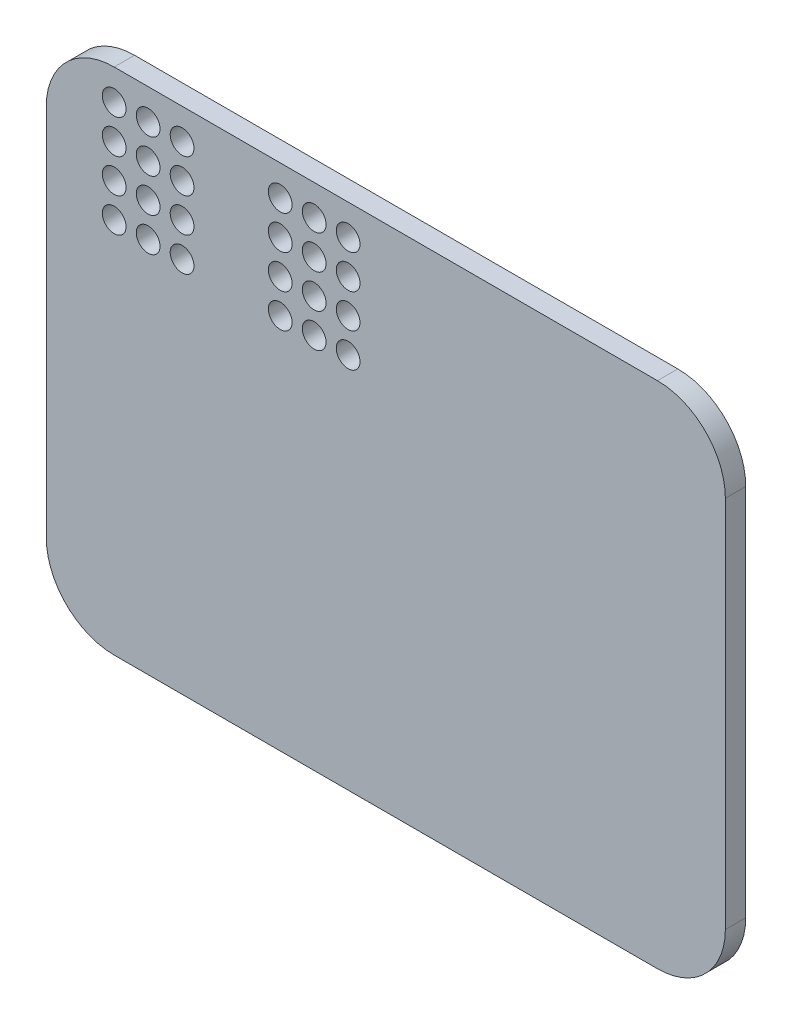
ISO-10303-21;
HEADER;
FILE_DESCRIPTION(('STEP AP214'),'2;1');
FILE_NAME('part.step','',(''),(''),'','','');
FILE_SCHEMA(('AUTOMOTIVE_DESIGN { 1 0 10303 214 1 1 1 1 }'));
ENDSEC;
DATA;
#1=APPLICATION_CONTEXT('core data for automotive mechanical design processes');
#2=APPLICATION_PROTOCOL_DEFINITION('international standard','automotive_design',2000,#1);
#3=PRODUCT_CONTEXT('',#1,'mechanical');
#4=PRODUCT('Part','Part','',(#3));
#5=PRODUCT_RELATED_PRODUCT_CATEGORY('part','',(#4));
#6=PRODUCT_DEFINITION_FORMATION('','',#4);
#7=PRODUCT_DEFINITION_CONTEXT('part definition',#1,'design');
#8=PRODUCT_DEFINITION('design','',#6,#7);
#9=PRODUCT_DEFINITION_SHAPE('','',#8);
#10=(LENGTH_UNIT() NAMED_UNIT(*) SI_UNIT(.MILLI.,.METRE.));
#11=(NAMED_UNIT(*) PLANE_ANGLE_UNIT() SI_UNIT($,.RADIAN.));
#12=(NAMED_UNIT(*) SI_UNIT($,.STERADIAN.) SOLID_ANGLE_UNIT());
#13=UNCERTAINTY_MEASURE_WITH_UNIT(LENGTH_MEASURE(1.E-05),#10,'distance_accuracy_value','');
#14=(GEOMETRIC_REPRESENTATION_CONTEXT(3) GLOBAL_UNCERTAINTY_ASSIGNED_CONTEXT((#13)) GLOBAL_UNIT_ASSIGNED_CONTEXT((#10,
#11,#12)) REPRESENTATION_CONTEXT('',''));
#15=CARTESIAN_POINT('',(0.,0.,0.));
#16=DIRECTION('',(0.,0.,1.));
#17=DIRECTION('',(1.,0.,0.));
#18=AXIS2_PLACEMENT_3D('',#15,#16,#17);
#19=CARTESIAN_POINT('',(10.,65.,3.));
#20=DIRECTION('',(0.,0.,-1.));
#21=DIRECTION('',(-1.,0.,0.));
#22=AXIS2_PLACEMENT_3D('',#19,#20,#21);
#23=PLANE('',#22);
#24=CARTESIAN_POINT('',(10.,65.,3.));
#25=DIRECTION('',(0.,0.,1.));
#26=DIRECTION('',(-1.,0.,0.));
#27=AXIS2_PLACEMENT_3D('',#24,#25,#26);
#28=CIRCLE('',#27,10.);
#29=CARTESIAN_POINT('',(10.0000000000001,75.,3.));
#30=VERTEX_POINT('',#29);
#31=CARTESIAN_POINT('',(0.,64.9999999999999,3.));
#32=VERTEX_POINT('',#31);
#33=EDGE_CURVE('E170',#30,#32,#28,.T.);
#34=ORIENTED_EDGE('',*,*,#33,.T.);
#35=DIRECTION('',(0.,-1.,0.));
#36=VECTOR('',#35,1.);
#37=CARTESIAN_POINT('',(0.,10.0000000000001,3.));
#38=LINE('',#37,#36);
#39=CARTESIAN_POINT('',(0.,10.0000000000001,3.));
#40=VERTEX_POINT('',#39);
#41=EDGE_CURVE('E106',#32,#40,#38,.T.);
#42=ORIENTED_EDGE('',*,*,#41,.T.);
#43=CARTESIAN_POINT('',(10.,10.,3.));
#44=DIRECTION('',(0.,0.,1.));
#45=DIRECTION('',(-1.,0.,0.));
#46=AXIS2_PLACEMENT_3D('',#43,#44,#45);
#47=CIRCLE('',#46,10.);
#48=CARTESIAN_POINT('',(10.0000000000001,0.,3.));
#49=VERTEX_POINT('',#48);
#50=EDGE_CURVE('E191',#40,#49,#47,.T.);
#51=ORIENTED_EDGE('',*,*,#50,.T.);
#52=DIRECTION('',(1.,0.,0.));
#53=VECTOR('',#52,1.);
#54=CARTESIAN_POINT('',(10.0000000000001,0.,3.));
#55=LINE('',#54,#53);
#56=CARTESIAN_POINT('',(89.9999999999999,0.,3.));
#57=VERTEX_POINT('',#56);
#58=EDGE_CURVE('E205',#49,#57,#55,.T.);
#59=ORIENTED_EDGE('',*,*,#58,.T.);
#60=CARTESIAN_POINT('',(90.,10.,3.));
#61=DIRECTION('',(0.,0.,1.));
#62=DIRECTION('',(1.,0.,0.));
#63=AXIS2_PLACEMENT_3D('',#60,#61,#62);
#64=CIRCLE('',#63,10.);
#65=CARTESIAN_POINT('',(100.,10.,3.));
#66=VERTEX_POINT('',#65);
#67=EDGE_CURVE('E125',#57,#66,#64,.T.);
#68=ORIENTED_EDGE('',*,*,#67,.T.);
#69=DIRECTION('',(0.,1.,0.));
#70=VECTOR('',#69,1.);
#71=CARTESIAN_POINT('',(100.,10.0000000000001,3.));
#72=LINE('',#71,#70);
#73=CARTESIAN_POINT('',(100.,64.9999999999999,3.));
#74=VERTEX_POINT('',#73);
#75=EDGE_CURVE('E119',#66,#74,#72,.T.);
#76=ORIENTED_EDGE('',*,*,#75,.T.);
#77=CARTESIAN_POINT('',(90.,65.,3.));
#78=DIRECTION('',(0.,0.,1.));
#79=DIRECTION('',(-1.,0.,0.));
#80=AXIS2_PLACEMENT_3D('',#77,#78,#79);
#81=CIRCLE('',#80,9.99999999999999);
#82=CARTESIAN_POINT('',(89.9999999999999,75.,3.));
#83=VERTEX_POINT('',#82);
#84=EDGE_CURVE('E123',#74,#83,#81,.T.);
#85=ORIENTED_EDGE('',*,*,#84,.T.);
#86=DIRECTION('',(-1.,0.,0.));
#87=VECTOR('',#86,1.);
#88=CARTESIAN_POINT('',(10.0000000000001,75.,3.));
#89=LINE('',#88,#87);
#90=EDGE_CURVE('E63',#83,#30,#89,.T.);
#91=ORIENTED_EDGE('',*,*,#90,.T.);
#92=EDGE_LOOP('',(#34,#42,#51,#59,#68,#76,#85,#91));
#93=FACE_BOUND('',#92,.T.);
#94=CARTESIAN_POINT('',(10.,70.5,3.));
#95=DIRECTION('',(0.,0.,1.));
#96=DIRECTION('',(1.,0.,0.));
#97=AXIS2_PLACEMENT_3D('',#94,#95,#96);
#98=CIRCLE('',#97,1.75);
#99=CARTESIAN_POINT('',(11.75,70.5,3.));
#100=VERTEX_POINT('',#99);
#101=EDGE_CURVE('E152',#100,#100,#98,.T.);
#102=ORIENTED_EDGE('',*,*,#101,.F.);
#103=EDGE_LOOP('',(#102));
#104=FACE_BOUND('',#103,.T.);
#105=CARTESIAN_POINT('',(10.0000000000001,65.5,3.));
#106=DIRECTION('',(0.,0.,1.));
#107=DIRECTION('',(1.,0.,0.));
#108=AXIS2_PLACEMENT_3D('',#105,#106,#107);
#109=CIRCLE('',#108,1.75);
#110=CARTESIAN_POINT('',(11.7500000000001,65.5,3.));
#111=VERTEX_POINT('',#110);
#112=EDGE_CURVE('E219',#111,#111,#109,.T.);
#113=ORIENTED_EDGE('',*,*,#112,.F.);
#114=EDGE_LOOP('',(#113));
#115=FACE_BOUND('',#114,.T.);
#116=CARTESIAN_POINT('',(10.0000000000001,60.5,3.));
#117=DIRECTION('',(0.,0.,1.));
#118=DIRECTION('',(1.,0.,0.));
#119=AXIS2_PLACEMENT_3D('',#116,#117,#118);
#120=CIRCLE('',#119,1.75);
#121=CARTESIAN_POINT('',(11.7500000000001,60.5,3.));
#122=VERTEX_POINT('',#121);
#123=EDGE_CURVE('E227',#122,#122,#120,.T.);
#124=ORIENTED_EDGE('',*,*,#123,.F.);
#125=EDGE_LOOP('',(#124));
#126=FACE_BOUND('',#125,.T.);
#127=CARTESIAN_POINT('',(10.0000000000002,55.5,3.));
#128=DIRECTION('',(0.,0.,1.));
#129=DIRECTION('',(1.,0.,0.));
#130=AXIS2_PLACEMENT_3D('',#127,#128,#129);
#131=CIRCLE('',#130,1.75);
#132=CARTESIAN_POINT('',(11.7500000000002,55.5,3.));
#133=VERTEX_POINT('',#132);
#134=EDGE_CURVE('E235',#133,#133,#131,.T.);
#135=ORIENTED_EDGE('',*,*,#134,.F.);
#136=EDGE_LOOP('',(#135));
#137=FACE_BOUND('',#136,.T.);
#138=CARTESIAN_POINT('',(15.,70.5,3.));
#139=DIRECTION('',(0.,0.,1.));
#140=DIRECTION('',(1.,0.,0.));
#141=AXIS2_PLACEMENT_3D('',#138,#139,#140);
#142=CIRCLE('',#141,1.75);
#143=CARTESIAN_POINT('',(16.75,70.5,3.));
#144=VERTEX_POINT('',#143);
#145=EDGE_CURVE('E243',#144,#144,#142,.T.);
#146=ORIENTED_EDGE('',*,*,#145,.F.);
#147=EDGE_LOOP('',(#146));
#148=FACE_BOUND('',#147,.T.);
#149=CARTESIAN_POINT('',(15.0000000000001,65.5,3.));
#150=DIRECTION('',(0.,0.,1.));
#151=DIRECTION('',(1.,0.,0.));
#152=AXIS2_PLACEMENT_3D('',#149,#150,#151);
#153=CIRCLE('',#152,1.75);
#154=CARTESIAN_POINT('',(16.7500000000001,65.5,3.));
#155=VERTEX_POINT('',#154);
#156=EDGE_CURVE('E251',#155,#155,#153,.T.);
#157=ORIENTED_EDGE('',*,*,#156,.F.);
#158=EDGE_LOOP('',(#157));
#159=FACE_BOUND('',#158,.T.);
#160=CARTESIAN_POINT('',(15.0000000000001,60.5,3.));
#161=DIRECTION('',(0.,0.,1.));
#162=DIRECTION('',(1.,0.,0.));
#163=AXIS2_PLACEMENT_3D('',#160,#161,#162);
#164=CIRCLE('',#163,1.75);
#165=CARTESIAN_POINT('',(16.7500000000001,60.5,3.));
#166=VERTEX_POINT('',#165);
#167=EDGE_CURVE('E259',#166,#166,#164,.T.);
#168=ORIENTED_EDGE('',*,*,#167,.F.);
#169=EDGE_LOOP('',(#168));
#170=FACE_BOUND('',#169,.T.);
#171=CARTESIAN_POINT('',(15.0000000000002,55.5,3.));
#172=DIRECTION('',(0.,0.,1.));
#173=DIRECTION('',(1.,0.,0.));
#174=AXIS2_PLACEMENT_3D('',#171,#172,#173);
#175=CIRCLE('',#174,1.75);
#176=CARTESIAN_POINT('',(16.7500000000002,55.5,3.));
#177=VERTEX_POINT('',#176);
#178=EDGE_CURVE('E267',#177,#177,#175,.T.);
#179=ORIENTED_EDGE('',*,*,#178,.F.);
#180=EDGE_LOOP('',(#179));
#181=FACE_BOUND('',#180,.T.);
#182=CARTESIAN_POINT('',(20.,70.5,3.));
#183=DIRECTION('',(0.,0.,1.));
#184=DIRECTION('',(1.,0.,0.));
#185=AXIS2_PLACEMENT_3D('',#182,#183,#184);
#186=CIRCLE('',#185,1.75);
#187=CARTESIAN_POINT('',(21.75,70.5,3.));
#188=VERTEX_POINT('',#187);
#189=EDGE_CURVE('E275',#188,#188,#186,.T.);
#190=ORIENTED_EDGE('',*,*,#189,.F.);
#191=EDGE_LOOP('',(#190));
#192=FACE_BOUND('',#191,.T.);
#193=CARTESIAN_POINT('',(20.0000000000001,65.5,3.));
#194=DIRECTION('',(0.,0.,1.));
#195=DIRECTION('',(1.,0.,0.));
#196=AXIS2_PLACEMENT_3D('',#193,#194,#195);
#197=CIRCLE('',#196,1.75);
#198=CARTESIAN_POINT('',(21.7500000000001,65.5,3.));
#199=VERTEX_POINT('',#198);
#200=EDGE_CURVE('E283',#199,#199,#197,.T.);
#201=ORIENTED_EDGE('',*,*,#200,.F.);
#202=EDGE_LOOP('',(#201));
#203=FACE_BOUND('',#202,.T.);
#204=CARTESIAN_POINT('',(20.0000000000001,60.5,3.));
#205=DIRECTION('',(0.,0.,1.));
#206=DIRECTION('',(1.,0.,0.));
#207=AXIS2_PLACEMENT_3D('',#204,#205,#206);
#208=CIRCLE('',#207,1.75);
#209=CARTESIAN_POINT('',(21.7500000000001,60.5,3.));
#210=VERTEX_POINT('',#209);
#211=EDGE_CURVE('E291',#210,#210,#208,.T.);
#212=ORIENTED_EDGE('',*,*,#211,.F.);
#213=EDGE_LOOP('',(#212));
#214=FACE_BOUND('',#213,.T.);
#215=CARTESIAN_POINT('',(20.0000000000002,55.5,3.));
#216=DIRECTION('',(0.,0.,1.));
#217=DIRECTION('',(1.,0.,0.));
#218=AXIS2_PLACEMENT_3D('',#215,#216,#217);
#219=CIRCLE('',#218,1.75);
#220=CARTESIAN_POINT('',(21.7500000000002,55.5,3.));
#221=VERTEX_POINT('',#220);
#222=EDGE_CURVE('E299',#221,#221,#219,.T.);
#223=ORIENTED_EDGE('',*,*,#222,.F.);
#224=EDGE_LOOP('',(#223));
#225=FACE_BOUND('',#224,.T.);
#226=CARTESIAN_POINT('',(34.45,70.5,3.));
#227=DIRECTION('',(0.,0.,1.));
#228=DIRECTION('',(1.,0.,0.));
#229=AXIS2_PLACEMENT_3D('',#226,#227,#228);
#230=CIRCLE('',#229,1.75);
#231=CARTESIAN_POINT('',(36.2,70.5,3.));
#232=VERTEX_POINT('',#231);
#233=EDGE_CURVE('E307',#232,#232,#230,.T.);
#234=ORIENTED_EDGE('',*,*,#233,.F.);
#235=EDGE_LOOP('',(#234));
#236=FACE_BOUND('',#235,.T.);
#237=CARTESIAN_POINT('',(34.4500000000001,65.5,3.));
#238=DIRECTION('',(0.,0.,1.));
#239=DIRECTION('',(1.,0.,0.));
#240=AXIS2_PLACEMENT_3D('',#237,#238,#239);
#241=CIRCLE('',#240,1.75);
#242=CARTESIAN_POINT('',(36.2000000000001,65.5,3.));
#243=VERTEX_POINT('',#242);
#244=EDGE_CURVE('E315',#243,#243,#241,.T.);
#245=ORIENTED_EDGE('',*,*,#244,.F.);
#246=EDGE_LOOP('',(#245));
#247=FACE_BOUND('',#246,.T.);
#248=CARTESIAN_POINT('',(34.4500000000001,60.5,3.));
#249=DIRECTION('',(0.,0.,1.));
#250=DIRECTION('',(1.,0.,0.));
#251=AXIS2_PLACEMENT_3D('',#248,#249,#250);
#252=CIRCLE('',#251,1.75);
#253=CARTESIAN_POINT('',(36.2000000000001,60.5,3.));
#254=VERTEX_POINT('',#253);
#255=EDGE_CURVE('E323',#254,#254,#252,.T.);
#256=ORIENTED_EDGE('',*,*,#255,.F.);
#257=EDGE_LOOP('',(#256));
#258=FACE_BOUND('',#257,.T.);
#259=CARTESIAN_POINT('',(34.4500000000002,55.5,3.));
#260=DIRECTION('',(0.,0.,1.));
#261=DIRECTION('',(1.,0.,0.));
#262=AXIS2_PLACEMENT_3D('',#259,#260,#261);
#263=CIRCLE('',#262,1.75);
#264=CARTESIAN_POINT('',(36.2000000000002,55.5,3.));
#265=VERTEX_POINT('',#264);
#266=EDGE_CURVE('E331',#265,#265,#263,.T.);
#267=ORIENTED_EDGE('',*,*,#266,.F.);
#268=EDGE_LOOP('',(#267));
#269=FACE_BOUND('',#268,.T.);
#270=CARTESIAN_POINT('',(39.45,70.5,3.));
#271=DIRECTION('',(0.,0.,1.));
#272=DIRECTION('',(1.,0.,0.));
#273=AXIS2_PLACEMENT_3D('',#270,#271,#272);
#274=CIRCLE('',#273,1.75);
#275=CARTESIAN_POINT('',(41.2,70.5,3.));
#276=VERTEX_POINT('',#275);
#277=EDGE_CURVE('E339',#276,#276,#274,.T.);
#278=ORIENTED_EDGE('',*,*,#277,.F.);
#279=EDGE_LOOP('',(#278));
#280=FACE_BOUND('',#279,.T.);
#281=CARTESIAN_POINT('',(39.45,65.5,3.));
#282=DIRECTION('',(0.,0.,1.));
#283=DIRECTION('',(1.,0.,0.));
#284=AXIS2_PLACEMENT_3D('',#281,#282,#283);
#285=CIRCLE('',#284,1.75);
#286=CARTESIAN_POINT('',(41.2,65.5,3.));
#287=VERTEX_POINT('',#286);
#288=EDGE_CURVE('E347',#287,#287,#285,.T.);
#289=ORIENTED_EDGE('',*,*,#288,.F.);
#290=EDGE_LOOP('',(#289));
#291=FACE_BOUND('',#290,.T.);
#292=CARTESIAN_POINT('',(39.4500000000001,60.5,3.));
#293=DIRECTION('',(0.,0.,1.));
#294=DIRECTION('',(1.,0.,0.));
#295=AXIS2_PLACEMENT_3D('',#292,#293,#294);
#296=CIRCLE('',#295,1.75);
#297=CARTESIAN_POINT('',(41.2000000000001,60.5,3.));
#298=VERTEX_POINT('',#297);
#299=EDGE_CURVE('E355',#298,#298,#296,.T.);
#300=ORIENTED_EDGE('',*,*,#299,.F.);
#301=EDGE_LOOP('',(#300));
#302=FACE_BOUND('',#301,.T.);
#303=CARTESIAN_POINT('',(39.4500000000002,55.5,3.));
#304=DIRECTION('',(0.,0.,1.));
#305=DIRECTION('',(1.,0.,0.));
#306=AXIS2_PLACEMENT_3D('',#303,#304,#305);
#307=CIRCLE('',#306,1.75);
#308=CARTESIAN_POINT('',(41.2000000000002,55.5,3.));
#309=VERTEX_POINT('',#308);
#310=EDGE_CURVE('E363',#309,#309,#307,.T.);
#311=ORIENTED_EDGE('',*,*,#310,.F.);
#312=EDGE_LOOP('',(#311));
#313=FACE_BOUND('',#312,.T.);
#314=CARTESIAN_POINT('',(44.45,70.5,3.));
#315=DIRECTION('',(0.,0.,1.));
#316=DIRECTION('',(1.,0.,0.));
#317=AXIS2_PLACEMENT_3D('',#314,#315,#316);
#318=CIRCLE('',#317,1.75);
#319=CARTESIAN_POINT('',(46.2,70.5,3.));
#320=VERTEX_POINT('',#319);
#321=EDGE_CURVE('E371',#320,#320,#318,.T.);
#322=ORIENTED_EDGE('',*,*,#321,.F.);
#323=EDGE_LOOP('',(#322));
#324=FACE_BOUND('',#323,.T.);
#325=CARTESIAN_POINT('',(44.45,65.5,3.));
#326=DIRECTION('',(0.,0.,1.));
#327=DIRECTION('',(1.,0.,0.));
#328=AXIS2_PLACEMENT_3D('',#325,#326,#327);
#329=CIRCLE('',#328,1.75);
#330=CARTESIAN_POINT('',(46.2,65.5,3.));
#331=VERTEX_POINT('',#330);
#332=EDGE_CURVE('E379',#331,#331,#329,.T.);
#333=ORIENTED_EDGE('',*,*,#332,.F.);
#334=EDGE_LOOP('',(#333));
#335=FACE_BOUND('',#334,.T.);
#336=CARTESIAN_POINT('',(44.4500000000001,60.5,3.));
#337=DIRECTION('',(0.,0.,1.));
#338=DIRECTION('',(1.,0.,0.));
#339=AXIS2_PLACEMENT_3D('',#336,#337,#338);
#340=CIRCLE('',#339,1.75);
#341=CARTESIAN_POINT('',(46.2000000000001,60.5,3.));
#342=VERTEX_POINT('',#341);
#343=EDGE_CURVE('E387',#342,#342,#340,.T.);
#344=ORIENTED_EDGE('',*,*,#343,.F.);
#345=EDGE_LOOP('',(#344));
#346=FACE_BOUND('',#345,.T.);
#347=CARTESIAN_POINT('',(44.4500000000002,55.5,3.));
#348=DIRECTION('',(0.,0.,1.));
#349=DIRECTION('',(1.,0.,0.));
#350=AXIS2_PLACEMENT_3D('',#347,#348,#349);
#351=CIRCLE('',#350,1.75);
#352=CARTESIAN_POINT('',(46.2000000000002,55.5,3.));
#353=VERTEX_POINT('',#352);
#354=EDGE_CURVE('E395',#353,#353,#351,.T.);
#355=ORIENTED_EDGE('',*,*,#354,.F.);
#356=EDGE_LOOP('',(#355));
#357=FACE_BOUND('',#356,.T.);
#358=ADVANCED_FACE('F45',(#93,#104,#115,#126,#137,#148,#159,#170,#181,#192,#203,#214,#225,#236,
#247,#258,#269,#280,#291,#302,#313,#324,#335,#346,#357),#23,.F.);
#359=CARTESIAN_POINT('',(10.,65.,0.));
#360=DIRECTION('',(0.,0.,-1.));
#361=DIRECTION('',(-1.,0.,0.));
#362=AXIS2_PLACEMENT_3D('',#359,#360,#361);
#363=PLANE('',#362);
#364=CARTESIAN_POINT('',(44.4500000000001,60.5,0.));
#365=DIRECTION('',(0.,0.,1.));
#366=DIRECTION('',(1.,0.,0.));
#367=AXIS2_PLACEMENT_3D('',#364,#365,#366);
#368=CIRCLE('',#367,1.75);
#369=CARTESIAN_POINT('',(46.2000000000001,60.5,0.));
#370=VERTEX_POINT('',#369);
#371=EDGE_CURVE('E391',#370,#370,#368,.T.);
#372=ORIENTED_EDGE('',*,*,#371,.T.);
#373=EDGE_LOOP('',(#372));
#374=FACE_BOUND('',#373,.T.);
#375=CARTESIAN_POINT('',(44.45,70.5,0.));
#376=DIRECTION('',(0.,0.,1.));
#377=DIRECTION('',(1.,0.,0.));
#378=AXIS2_PLACEMENT_3D('',#375,#376,#377);
#379=CIRCLE('',#378,1.75);
#380=CARTESIAN_POINT('',(46.2,70.5,0.));
#381=VERTEX_POINT('',#380);
#382=EDGE_CURVE('E375',#381,#381,#379,.T.);
#383=ORIENTED_EDGE('',*,*,#382,.T.);
#384=EDGE_LOOP('',(#383));
#385=FACE_BOUND('',#384,.T.);
#386=CARTESIAN_POINT('',(39.4500000000001,60.5,0.));
#387=DIRECTION('',(0.,0.,1.));
#388=DIRECTION('',(1.,0.,0.));
#389=AXIS2_PLACEMENT_3D('',#386,#387,#388);
#390=CIRCLE('',#389,1.75);
#391=CARTESIAN_POINT('',(41.2000000000001,60.5,0.));
#392=VERTEX_POINT('',#391);
#393=EDGE_CURVE('E359',#392,#392,#390,.T.);
#394=ORIENTED_EDGE('',*,*,#393,.T.);
#395=EDGE_LOOP('',(#394));
#396=FACE_BOUND('',#395,.T.);
#397=CARTESIAN_POINT('',(39.45,70.5,0.));
#398=DIRECTION('',(0.,0.,1.));
#399=DIRECTION('',(1.,0.,0.));
#400=AXIS2_PLACEMENT_3D('',#397,#398,#399);
#401=CIRCLE('',#400,1.75);
#402=CARTESIAN_POINT('',(41.2,70.5,0.));
#403=VERTEX_POINT('',#402);
#404=EDGE_CURVE('E343',#403,#403,#401,.T.);
#405=ORIENTED_EDGE('',*,*,#404,.T.);
#406=EDGE_LOOP('',(#405));
#407=FACE_BOUND('',#406,.T.);
#408=CARTESIAN_POINT('',(34.4500000000001,60.5,0.));
#409=DIRECTION('',(0.,0.,1.));
#410=DIRECTION('',(1.,0.,0.));
#411=AXIS2_PLACEMENT_3D('',#408,#409,#410);
#412=CIRCLE('',#411,1.75);
#413=CARTESIAN_POINT('',(36.2000000000001,60.5,0.));
#414=VERTEX_POINT('',#413);
#415=EDGE_CURVE('E327',#414,#414,#412,.T.);
#416=ORIENTED_EDGE('',*,*,#415,.T.);
#417=EDGE_LOOP('',(#416));
#418=FACE_BOUND('',#417,.T.);
#419=CARTESIAN_POINT('',(34.45,70.5,0.));
#420=DIRECTION('',(0.,0.,1.));
#421=DIRECTION('',(1.,0.,0.));
#422=AXIS2_PLACEMENT_3D('',#419,#420,#421);
#423=CIRCLE('',#422,1.75);
#424=CARTESIAN_POINT('',(36.2,70.5,0.));
#425=VERTEX_POINT('',#424);
#426=EDGE_CURVE('E311',#425,#425,#423,.T.);
#427=ORIENTED_EDGE('',*,*,#426,.T.);
#428=EDGE_LOOP('',(#427));
#429=FACE_BOUND('',#428,.T.);
#430=CARTESIAN_POINT('',(20.0000000000001,60.5,0.));
#431=DIRECTION('',(0.,0.,1.));
#432=DIRECTION('',(1.,0.,0.));
#433=AXIS2_PLACEMENT_3D('',#430,#431,#432);
#434=CIRCLE('',#433,1.75);
#435=CARTESIAN_POINT('',(21.7500000000001,60.5,0.));
#436=VERTEX_POINT('',#435);
#437=EDGE_CURVE('E295',#436,#436,#434,.T.);
#438=ORIENTED_EDGE('',*,*,#437,.T.);
#439=EDGE_LOOP('',(#438));
#440=FACE_BOUND('',#439,.T.);
#441=CARTESIAN_POINT('',(20.,70.5,0.));
#442=DIRECTION('',(0.,0.,1.));
#443=DIRECTION('',(1.,0.,0.));
#444=AXIS2_PLACEMENT_3D('',#441,#442,#443);
#445=CIRCLE('',#444,1.75);
#446=CARTESIAN_POINT('',(21.75,70.5,0.));
#447=VERTEX_POINT('',#446);
#448=EDGE_CURVE('E279',#447,#447,#445,.T.);
#449=ORIENTED_EDGE('',*,*,#448,.T.);
#450=EDGE_LOOP('',(#449));
#451=FACE_BOUND('',#450,.T.);
#452=CARTESIAN_POINT('',(15.0000000000001,60.5,0.));
#453=DIRECTION('',(0.,0.,1.));
#454=DIRECTION('',(1.,0.,0.));
#455=AXIS2_PLACEMENT_3D('',#452,#453,#454);
#456=CIRCLE('',#455,1.75);
#457=CARTESIAN_POINT('',(16.7500000000001,60.5,0.));
#458=VERTEX_POINT('',#457);
#459=EDGE_CURVE('E263',#458,#458,#456,.T.);
#460=ORIENTED_EDGE('',*,*,#459,.T.);
#461=EDGE_LOOP('',(#460));
#462=FACE_BOUND('',#461,.T.);
#463=CARTESIAN_POINT('',(15.,70.5,0.));
#464=DIRECTION('',(0.,0.,1.));
#465=DIRECTION('',(1.,0.,0.));
#466=AXIS2_PLACEMENT_3D('',#463,#464,#465);
#467=CIRCLE('',#466,1.75);
#468=CARTESIAN_POINT('',(16.75,70.5,0.));
#469=VERTEX_POINT('',#468);
#470=EDGE_CURVE('E247',#469,#469,#467,.T.);
#471=ORIENTED_EDGE('',*,*,#470,.T.);
#472=EDGE_LOOP('',(#471));
#473=FACE_BOUND('',#472,.T.);
#474=CARTESIAN_POINT('',(10.0000000000001,60.5,0.));
#475=DIRECTION('',(0.,0.,1.));
#476=DIRECTION('',(1.,0.,0.));
#477=AXIS2_PLACEMENT_3D('',#474,#475,#476);
#478=CIRCLE('',#477,1.75);
#479=CARTESIAN_POINT('',(11.7500000000001,60.5,0.));
#480=VERTEX_POINT('',#479);
#481=EDGE_CURVE('E231',#480,#480,#478,.T.);
#482=ORIENTED_EDGE('',*,*,#481,.T.);
#483=EDGE_LOOP('',(#482));
#484=FACE_BOUND('',#483,.T.);
#485=CARTESIAN_POINT('',(10.,70.5,0.));
#486=DIRECTION('',(0.,0.,1.));
#487=DIRECTION('',(1.,0.,0.));
#488=AXIS2_PLACEMENT_3D('',#485,#486,#487);
#489=CIRCLE('',#488,1.75);
#490=CARTESIAN_POINT('',(11.75,70.5,0.));
#491=VERTEX_POINT('',#490);
#492=EDGE_CURVE('E215',#491,#491,#489,.T.);
#493=ORIENTED_EDGE('',*,*,#492,.T.);
#494=EDGE_LOOP('',(#493));
#495=FACE_BOUND('',#494,.T.);
#496=CARTESIAN_POINT('',(10.,65.,0.));
#497=DIRECTION('',(0.,0.,1.));
#498=DIRECTION('',(-1.,0.,0.));
#499=AXIS2_PLACEMENT_3D('',#496,#497,#498);
#500=CIRCLE('',#499,10.);
#501=CARTESIAN_POINT('',(10.0000000000001,75.,0.));
#502=VERTEX_POINT('',#501);
#503=CARTESIAN_POINT('',(0.,64.9999999999999,0.));
#504=VERTEX_POINT('',#503);
#505=EDGE_CURVE('E147',#502,#504,#500,.T.);
#506=ORIENTED_EDGE('',*,*,#505,.F.);
#507=DIRECTION('',(-1.,0.,0.));
#508=VECTOR('',#507,1.);
#509=CARTESIAN_POINT('',(10.0000000000001,75.,0.));
#510=LINE('',#509,#508);
#511=CARTESIAN_POINT('',(89.9999999999999,75.,0.));
#512=VERTEX_POINT('',#511);
#513=EDGE_CURVE('E98',#512,#502,#510,.T.);
#514=ORIENTED_EDGE('',*,*,#513,.F.);
#515=CARTESIAN_POINT('',(90.,65.,0.));
#516=DIRECTION('',(0.,0.,1.));
#517=DIRECTION('',(-1.,0.,0.));
#518=AXIS2_PLACEMENT_3D('',#515,#516,#517);
#519=CIRCLE('',#518,9.99999999999999);
#520=CARTESIAN_POINT('',(100.,64.9999999999999,0.));
#521=VERTEX_POINT('',#520);
#522=EDGE_CURVE('E92',#521,#512,#519,.T.);
#523=ORIENTED_EDGE('',*,*,#522,.F.);
#524=DIRECTION('',(0.,1.,0.));
#525=VECTOR('',#524,1.);
#526=CARTESIAN_POINT('',(100.,10.0000000000001,0.));
#527=LINE('',#526,#525);
#528=CARTESIAN_POINT('',(100.,10.,0.));
#529=VERTEX_POINT('',#528);
#530=EDGE_CURVE('E134',#529,#521,#527,.T.);
#531=ORIENTED_EDGE('',*,*,#530,.F.);
#532=CARTESIAN_POINT('',(90.,10.,0.));
#533=DIRECTION('',(0.,0.,1.));
#534=DIRECTION('',(1.,0.,0.));
#535=AXIS2_PLACEMENT_3D('',#532,#533,#534);
#536=CIRCLE('',#535,10.);
#537=CARTESIAN_POINT('',(89.9999999999999,0.,0.));
#538=VERTEX_POINT('',#537);
#539=EDGE_CURVE('E161',#538,#529,#536,.T.);
#540=ORIENTED_EDGE('',*,*,#539,.F.);
#541=DIRECTION('',(1.,0.,0.));
#542=VECTOR('',#541,1.);
#543=CARTESIAN_POINT('',(10.0000000000001,0.,0.));
#544=LINE('',#543,#542);
#545=CARTESIAN_POINT('',(10.0000000000001,0.,0.));
#546=VERTEX_POINT('',#545);
#547=EDGE_CURVE('E158',#546,#538,#544,.T.);
#548=ORIENTED_EDGE('',*,*,#547,.F.);
#549=CARTESIAN_POINT('',(10.,10.,0.));
#550=DIRECTION('',(0.,0.,1.));
#551=DIRECTION('',(-1.,0.,0.));
#552=AXIS2_PLACEMENT_3D('',#549,#550,#551);
#553=CIRCLE('',#552,10.);
#554=CARTESIAN_POINT('',(0.,10.0000000000001,0.));
#555=VERTEX_POINT('',#554);
#556=EDGE_CURVE('E155',#555,#546,#553,.T.);
#557=ORIENTED_EDGE('',*,*,#556,.F.);
#558=DIRECTION('',(0.,-1.,0.));
#559=VECTOR('',#558,1.);
#560=CARTESIAN_POINT('',(0.,10.0000000000001,0.));
#561=LINE('',#560,#559);
#562=EDGE_CURVE('E151',#504,#555,#561,.T.);
#563=ORIENTED_EDGE('',*,*,#562,.F.);
#564=EDGE_LOOP('',(#506,#514,#523,#531,#540,#548,#557,#563));
#565=FACE_BOUND('',#564,.T.);
#566=CARTESIAN_POINT('',(10.0000000000001,65.5,0.));
#567=DIRECTION('',(0.,0.,1.));
#568=DIRECTION('',(1.,0.,0.));
#569=AXIS2_PLACEMENT_3D('',#566,#567,#568);
#570=CIRCLE('',#569,1.75);
#571=CARTESIAN_POINT('',(11.7500000000001,65.5,0.));
#572=VERTEX_POINT('',#571);
#573=EDGE_CURVE('E223',#572,#572,#570,.T.);
#574=ORIENTED_EDGE('',*,*,#573,.T.);
#575=EDGE_LOOP('',(#574));
#576=FACE_BOUND('',#575,.T.);
#577=CARTESIAN_POINT('',(10.0000000000002,55.5,0.));
#578=DIRECTION('',(0.,0.,1.));
#579=DIRECTION('',(1.,0.,0.));
#580=AXIS2_PLACEMENT_3D('',#577,#578,#579);
#581=CIRCLE('',#580,1.75);
#582=CARTESIAN_POINT('',(11.7500000000002,55.5,0.));
#583=VERTEX_POINT('',#582);
#584=EDGE_CURVE('E239',#583,#583,#581,.T.);
#585=ORIENTED_EDGE('',*,*,#584,.T.);
#586=EDGE_LOOP('',(#585));
#587=FACE_BOUND('',#586,.T.);
#588=CARTESIAN_POINT('',(15.0000000000001,65.5,0.));
#589=DIRECTION('',(0.,0.,1.));
#590=DIRECTION('',(1.,0.,0.));
#591=AXIS2_PLACEMENT_3D('',#588,#589,#590);
#592=CIRCLE('',#591,1.75);
#593=CARTESIAN_POINT('',(16.7500000000001,65.5,0.));
#594=VERTEX_POINT('',#593);
#595=EDGE_CURVE('E255',#594,#594,#592,.T.);
#596=ORIENTED_EDGE('',*,*,#595,.T.);
#597=EDGE_LOOP('',(#596));
#598=FACE_BOUND('',#597,.T.);
#599=CARTESIAN_POINT('',(15.0000000000002,55.5,0.));
#600=DIRECTION('',(0.,0.,1.));
#601=DIRECTION('',(1.,0.,0.));
#602=AXIS2_PLACEMENT_3D('',#599,#600,#601);
#603=CIRCLE('',#602,1.75);
#604=CARTESIAN_POINT('',(16.7500000000002,55.5,0.));
#605=VERTEX_POINT('',#604);
#606=EDGE_CURVE('E271',#605,#605,#603,.T.);
#607=ORIENTED_EDGE('',*,*,#606,.T.);
#608=EDGE_LOOP('',(#607));
#609=FACE_BOUND('',#608,.T.);
#610=CARTESIAN_POINT('',(20.0000000000001,65.5,0.));
#611=DIRECTION('',(0.,0.,1.));
#612=DIRECTION('',(1.,0.,0.));
#613=AXIS2_PLACEMENT_3D('',#610,#611,#612);
#614=CIRCLE('',#613,1.75);
#615=CARTESIAN_POINT('',(21.7500000000001,65.5,0.));
#616=VERTEX_POINT('',#615);
#617=EDGE_CURVE('E287',#616,#616,#614,.T.);
#618=ORIENTED_EDGE('',*,*,#617,.T.);
#619=EDGE_LOOP('',(#618));
#620=FACE_BOUND('',#619,.T.);
#621=CARTESIAN_POINT('',(20.0000000000002,55.5,0.));
#622=DIRECTION('',(0.,0.,1.));
#623=DIRECTION('',(1.,0.,0.));
#624=AXIS2_PLACEMENT_3D('',#621,#622,#623);
#625=CIRCLE('',#624,1.75);
#626=CARTESIAN_POINT('',(21.7500000000002,55.5,0.));
#627=VERTEX_POINT('',#626);
#628=EDGE_CURVE('E303',#627,#627,#625,.T.);
#629=ORIENTED_EDGE('',*,*,#628,.T.);
#630=EDGE_LOOP('',(#629));
#631=FACE_BOUND('',#630,.T.);
#632=CARTESIAN_POINT('',(34.4500000000001,65.5,0.));
#633=DIRECTION('',(0.,0.,1.));
#634=DIRECTION('',(1.,0.,0.));
#635=AXIS2_PLACEMENT_3D('',#632,#633,#634);
#636=CIRCLE('',#635,1.75);
#637=CARTESIAN_POINT('',(36.2000000000001,65.5,0.));
#638=VERTEX_POINT('',#637);
#639=EDGE_CURVE('E319',#638,#638,#636,.T.);
#640=ORIENTED_EDGE('',*,*,#639,.T.);
#641=EDGE_LOOP('',(#640));
#642=FACE_BOUND('',#641,.T.);
#643=CARTESIAN_POINT('',(34.4500000000002,55.5,0.));
#644=DIRECTION('',(0.,0.,1.));
#645=DIRECTION('',(1.,0.,0.));
#646=AXIS2_PLACEMENT_3D('',#643,#644,#645);
#647=CIRCLE('',#646,1.75);
#648=CARTESIAN_POINT('',(36.2000000000002,55.5,0.));
#649=VERTEX_POINT('',#648);
#650=EDGE_CURVE('E335',#649,#649,#647,.T.);
#651=ORIENTED_EDGE('',*,*,#650,.T.);
#652=EDGE_LOOP('',(#651));
#653=FACE_BOUND('',#652,.T.);
#654=CARTESIAN_POINT('',(39.45,65.5,0.));
#655=DIRECTION('',(0.,0.,1.));
#656=DIRECTION('',(1.,0.,0.));
#657=AXIS2_PLACEMENT_3D('',#654,#655,#656);
#658=CIRCLE('',#657,1.75);
#659=CARTESIAN_POINT('',(41.2,65.5,0.));
#660=VERTEX_POINT('',#659);
#661=EDGE_CURVE('E351',#660,#660,#658,.T.);
#662=ORIENTED_EDGE('',*,*,#661,.T.);
#663=EDGE_LOOP('',(#662));
#664=FACE_BOUND('',#663,.T.);
#665=CARTESIAN_POINT('',(39.4500000000002,55.5,0.));
#666=DIRECTION('',(0.,0.,1.));
#667=DIRECTION('',(1.,0.,0.));
#668=AXIS2_PLACEMENT_3D('',#665,#666,#667);
#669=CIRCLE('',#668,1.75);
#670=CARTESIAN_POINT('',(41.2000000000002,55.5,0.));
#671=VERTEX_POINT('',#670);
#672=EDGE_CURVE('E367',#671,#671,#669,.T.);
#673=ORIENTED_EDGE('',*,*,#672,.T.);
#674=EDGE_LOOP('',(#673));
#675=FACE_BOUND('',#674,.T.);
#676=CARTESIAN_POINT('',(44.45,65.5,0.));
#677=DIRECTION('',(0.,0.,1.));
#678=DIRECTION('',(1.,0.,0.));
#679=AXIS2_PLACEMENT_3D('',#676,#677,#678);
#680=CIRCLE('',#679,1.75);
#681=CARTESIAN_POINT('',(46.2,65.5,0.));
#682=VERTEX_POINT('',#681);
#683=EDGE_CURVE('E383',#682,#682,#680,.T.);
#684=ORIENTED_EDGE('',*,*,#683,.T.);
#685=EDGE_LOOP('',(#684));
#686=FACE_BOUND('',#685,.T.);
#687=CARTESIAN_POINT('',(44.4500000000002,55.5,0.));
#688=DIRECTION('',(0.,0.,1.));
#689=DIRECTION('',(1.,0.,0.));
#690=AXIS2_PLACEMENT_3D('',#687,#688,#689);
#691=CIRCLE('',#690,1.75);
#692=CARTESIAN_POINT('',(46.2000000000002,55.5,0.));
#693=VERTEX_POINT('',#692);
#694=EDGE_CURVE('E399',#693,#693,#691,.T.);
#695=ORIENTED_EDGE('',*,*,#694,.T.);
#696=EDGE_LOOP('',(#695));
#697=FACE_BOUND('',#696,.T.);
#698=ADVANCED_FACE('F195',(#374,#385,#396,#407,#418,#429,#440,#451,#462,#473,#484,#495,#565,
#576,#587,#598,#609,#620,#631,#642,#653,#664,#675,#686,#697),#363,.T.);
#699=CARTESIAN_POINT('',(10.,65.,3.));
#700=DIRECTION('',(0.,0.,-1.));
#701=DIRECTION('',(-1.,0.,0.));
#702=AXIS2_PLACEMENT_3D('',#699,#700,#701);
#703=CYLINDRICAL_SURFACE('',#702,10.);
#704=ORIENTED_EDGE('',*,*,#505,.T.);
#705=DIRECTION('',(0.,0.,-1.));
#706=VECTOR('',#705,1.);
#707=CARTESIAN_POINT('',(0.,64.9999999999999,3.));
#708=LINE('',#707,#706);
#709=EDGE_CURVE('E11',#32,#504,#708,.T.);
#710=ORIENTED_EDGE('',*,*,#709,.F.);
#711=ORIENTED_EDGE('',*,*,#33,.F.);
#712=DIRECTION('',(0.,0.,-1.));
#713=VECTOR('',#712,1.);
#714=CARTESIAN_POINT('',(10.0000000000001,75.,3.));
#715=LINE('',#714,#713);
#716=EDGE_CURVE('E143',#30,#502,#715,.T.);
#717=ORIENTED_EDGE('',*,*,#716,.T.);
#718=EDGE_LOOP('',(#704,#710,#711,#717));
#719=FACE_BOUND('',#718,.T.);
#720=ADVANCED_FACE('F47',(#719),#703,.T.);
#721=CARTESIAN_POINT('',(0.,10.0000000000001,3.));
#722=DIRECTION('',(1.,0.,0.));
#723=DIRECTION('',(0.,0.,-1.));
#724=AXIS2_PLACEMENT_3D('',#721,#722,#723);
#725=PLANE('',#724);
#726=ORIENTED_EDGE('',*,*,#562,.T.);
#727=DIRECTION('',(0.,0.,-1.));
#728=VECTOR('',#727,1.);
#729=CARTESIAN_POINT('',(0.,10.0000000000001,3.));
#730=LINE('',#729,#728);
#731=EDGE_CURVE('E55',#40,#555,#730,.T.);
#732=ORIENTED_EDGE('',*,*,#731,.F.);
#733=ORIENTED_EDGE('',*,*,#41,.F.);
#734=ORIENTED_EDGE('',*,*,#709,.T.);
#735=EDGE_LOOP('',(#726,#732,#733,#734));
#736=FACE_BOUND('',#735,.T.);
#737=ADVANCED_FACE('F433',(#736),#725,.F.);
#738=CARTESIAN_POINT('',(10.,10.,3.));
#739=DIRECTION('',(0.,0.,-1.));
#740=DIRECTION('',(-1.,0.,0.));
#741=AXIS2_PLACEMENT_3D('',#738,#739,#740);
#742=CYLINDRICAL_SURFACE('',#741,10.);
#743=ORIENTED_EDGE('',*,*,#556,.T.);
#744=DIRECTION('',(0.,0.,-1.));
#745=VECTOR('',#744,1.);
#746=CARTESIAN_POINT('',(10.0000000000001,0.,3.));
#747=LINE('',#746,#745);
#748=EDGE_CURVE('E181',#49,#546,#747,.T.);
#749=ORIENTED_EDGE('',*,*,#748,.F.);
#750=ORIENTED_EDGE('',*,*,#50,.F.);
#751=ORIENTED_EDGE('',*,*,#731,.T.);
#752=EDGE_LOOP('',(#743,#749,#750,#751));
#753=FACE_BOUND('',#752,.T.);
#754=ADVANCED_FACE('F189',(#753),#742,.T.);
#755=CARTESIAN_POINT('',(10.0000000000001,0.,3.));
#756=DIRECTION('',(0.,1.,0.));
#757=DIRECTION('',(0.,0.,1.));
#758=AXIS2_PLACEMENT_3D('',#755,#756,#757);
#759=PLANE('',#758);
#760=ORIENTED_EDGE('',*,*,#547,.T.);
#761=DIRECTION('',(0.,0.,-1.));
#762=VECTOR('',#761,1.);
#763=CARTESIAN_POINT('',(89.9999999999999,0.,3.));
#764=LINE('',#763,#762);
#765=EDGE_CURVE('E177',#57,#538,#764,.T.);
#766=ORIENTED_EDGE('',*,*,#765,.F.);
#767=ORIENTED_EDGE('',*,*,#58,.F.);
#768=ORIENTED_EDGE('',*,*,#748,.T.);
#769=EDGE_LOOP('',(#760,#766,#767,#768));
#770=FACE_BOUND('',#769,.T.);
#771=ADVANCED_FACE('F200',(#770),#759,.F.);
#772=CARTESIAN_POINT('',(90.,10.,3.));
#773=DIRECTION('',(0.,0.,-1.));
#774=DIRECTION('',(-1.,0.,0.));
#775=AXIS2_PLACEMENT_3D('',#772,#773,#774);
#776=CYLINDRICAL_SURFACE('',#775,10.);
#777=ORIENTED_EDGE('',*,*,#539,.T.);
#778=DIRECTION('',(0.,0.,-1.));
#779=VECTOR('',#778,1.);
#780=CARTESIAN_POINT('',(100.,10.,3.));
#781=LINE('',#780,#779);
#782=EDGE_CURVE('E136',#66,#529,#781,.T.);
#783=ORIENTED_EDGE('',*,*,#782,.F.);
#784=ORIENTED_EDGE('',*,*,#67,.F.);
#785=ORIENTED_EDGE('',*,*,#765,.T.);
#786=EDGE_LOOP('',(#777,#783,#784,#785));
#787=FACE_BOUND('',#786,.T.);
#788=ADVANCED_FACE('F203',(#787),#776,.T.);
#789=CARTESIAN_POINT('',(100.,10.0000000000001,3.));
#790=DIRECTION('',(-1.,0.,0.));
#791=DIRECTION('',(0.,0.,1.));
#792=AXIS2_PLACEMENT_3D('',#789,#790,#791);
#793=PLANE('',#792);
#794=ORIENTED_EDGE('',*,*,#530,.T.);
#795=DIRECTION('',(0.,0.,-1.));
#796=VECTOR('',#795,1.);
#797=CARTESIAN_POINT('',(100.,64.9999999999999,3.));
#798=LINE('',#797,#796);
#799=EDGE_CURVE('E131',#74,#521,#798,.T.);
#800=ORIENTED_EDGE('',*,*,#799,.F.);
#801=ORIENTED_EDGE('',*,*,#75,.F.);
#802=ORIENTED_EDGE('',*,*,#782,.T.);
#803=EDGE_LOOP('',(#794,#800,#801,#802));
#804=FACE_BOUND('',#803,.T.);
#805=ADVANCED_FACE('F132',(#804),#793,.F.);
#806=CARTESIAN_POINT('',(90.,65.,3.));
#807=DIRECTION('',(0.,0.,-1.));
#808=DIRECTION('',(-1.,0.,0.));
#809=AXIS2_PLACEMENT_3D('',#806,#807,#808);
#810=CYLINDRICAL_SURFACE('',#809,9.99999999999999);
#811=ORIENTED_EDGE('',*,*,#522,.T.);
#812=DIRECTION('',(0.,0.,-1.));
#813=VECTOR('',#812,1.);
#814=CARTESIAN_POINT('',(89.9999999999999,75.,3.));
#815=LINE('',#814,#813);
#816=EDGE_CURVE('E137',#83,#512,#815,.T.);
#817=ORIENTED_EDGE('',*,*,#816,.F.);
#818=ORIENTED_EDGE('',*,*,#84,.F.);
#819=ORIENTED_EDGE('',*,*,#799,.T.);
#820=EDGE_LOOP('',(#811,#817,#818,#819));
#821=FACE_BOUND('',#820,.T.);
#822=ADVANCED_FACE('F139',(#821),#810,.T.);
#823=CARTESIAN_POINT('',(10.0000000000001,75.,3.));
#824=DIRECTION('',(0.,-1.,0.));
#825=DIRECTION('',(0.,0.,-1.));
#826=AXIS2_PLACEMENT_3D('',#823,#824,#825);
#827=PLANE('',#826);
#828=ORIENTED_EDGE('',*,*,#513,.T.);
#829=ORIENTED_EDGE('',*,*,#716,.F.);
#830=ORIENTED_EDGE('',*,*,#90,.F.);
#831=ORIENTED_EDGE('',*,*,#816,.T.);
#832=EDGE_LOOP('',(#828,#829,#830,#831));
#833=FACE_BOUND('',#832,.T.);
#834=ADVANCED_FACE('F421',(#833),#827,.F.);
#835=CARTESIAN_POINT('',(10.,70.5,3.));
#836=DIRECTION('',(0.,0.,-1.));
#837=DIRECTION('',(-1.,0.,0.));
#838=AXIS2_PLACEMENT_3D('',#835,#836,#837);
#839=CYLINDRICAL_SURFACE('',#838,1.75);
#840=ORIENTED_EDGE('',*,*,#101,.T.);
#841=EDGE_LOOP('',(#840));
#842=FACE_BOUND('',#841,.T.);
#843=ORIENTED_EDGE('',*,*,#492,.F.);
#844=EDGE_LOOP('',(#843));
#845=FACE_BOUND('',#844,.T.);
#846=ADVANCED_FACE('F418',(#842,#845),#839,.F.);
#847=CARTESIAN_POINT('',(10.0000000000001,65.5,3.));
#848=DIRECTION('',(0.,0.,-1.));
#849=DIRECTION('',(-1.,0.,0.));
#850=AXIS2_PLACEMENT_3D('',#847,#848,#849);
#851=CYLINDRICAL_SURFACE('',#850,1.75);
#852=ORIENTED_EDGE('',*,*,#112,.T.);
#853=EDGE_LOOP('',(#852));
#854=FACE_BOUND('',#853,.T.);
#855=ORIENTED_EDGE('',*,*,#573,.F.);
#856=EDGE_LOOP('',(#855));
#857=FACE_BOUND('',#856,.T.);
#858=ADVANCED_FACE('F496',(#854,#857),#851,.F.);
#859=CARTESIAN_POINT('',(10.0000000000001,60.5,3.));
#860=DIRECTION('',(0.,0.,-1.));
#861=DIRECTION('',(-1.,0.,0.));
#862=AXIS2_PLACEMENT_3D('',#859,#860,#861);
#863=CYLINDRICAL_SURFACE('',#862,1.75);
#864=ORIENTED_EDGE('',*,*,#123,.T.);
#865=EDGE_LOOP('',(#864));
#866=FACE_BOUND('',#865,.T.);
#867=ORIENTED_EDGE('',*,*,#481,.F.);
#868=EDGE_LOOP('',(#867));
#869=FACE_BOUND('',#868,.T.);
#870=ADVANCED_FACE('F504',(#866,#869),#863,.F.);
#871=CARTESIAN_POINT('',(10.0000000000002,55.5,3.));
#872=DIRECTION('',(0.,0.,-1.));
#873=DIRECTION('',(-1.,0.,0.));
#874=AXIS2_PLACEMENT_3D('',#871,#872,#873);
#875=CYLINDRICAL_SURFACE('',#874,1.75);
#876=ORIENTED_EDGE('',*,*,#134,.T.);
#877=EDGE_LOOP('',(#876));
#878=FACE_BOUND('',#877,.T.);
#879=ORIENTED_EDGE('',*,*,#584,.F.);
#880=EDGE_LOOP('',(#879));
#881=FACE_BOUND('',#880,.T.);
#882=ADVANCED_FACE('F512',(#878,#881),#875,.F.);
#883=CARTESIAN_POINT('',(15.,70.5,3.));
#884=DIRECTION('',(0.,0.,-1.));
#885=DIRECTION('',(-1.,0.,0.));
#886=AXIS2_PLACEMENT_3D('',#883,#884,#885);
#887=CYLINDRICAL_SURFACE('',#886,1.75);
#888=ORIENTED_EDGE('',*,*,#145,.T.);
#889=EDGE_LOOP('',(#888));
#890=FACE_BOUND('',#889,.T.);
#891=ORIENTED_EDGE('',*,*,#470,.F.);
#892=EDGE_LOOP('',(#891));
#893=FACE_BOUND('',#892,.T.);
#894=ADVANCED_FACE('F521',(#890,#893),#887,.F.);
#895=CARTESIAN_POINT('',(15.0000000000001,65.5,3.));
#896=DIRECTION('',(0.,0.,-1.));
#897=DIRECTION('',(-1.,0.,0.));
#898=AXIS2_PLACEMENT_3D('',#895,#896,#897);
#899=CYLINDRICAL_SURFACE('',#898,1.75);
#900=ORIENTED_EDGE('',*,*,#156,.T.);
#901=EDGE_LOOP('',(#900));
#902=FACE_BOUND('',#901,.T.);
#903=ORIENTED_EDGE('',*,*,#595,.F.);
#904=EDGE_LOOP('',(#903));
#905=FACE_BOUND('',#904,.T.);
#906=ADVANCED_FACE('F530',(#902,#905),#899,.F.);
#907=CARTESIAN_POINT('',(15.0000000000001,60.5,3.));
#908=DIRECTION('',(0.,0.,-1.));
#909=DIRECTION('',(-1.,0.,0.));
#910=AXIS2_PLACEMENT_3D('',#907,#908,#909);
#911=CYLINDRICAL_SURFACE('',#910,1.75);
#912=ORIENTED_EDGE('',*,*,#167,.T.);
#913=EDGE_LOOP('',(#912));
#914=FACE_BOUND('',#913,.T.);
#915=ORIENTED_EDGE('',*,*,#459,.F.);
#916=EDGE_LOOP('',(#915));
#917=FACE_BOUND('',#916,.T.);
#918=ADVANCED_FACE('F539',(#914,#917),#911,.F.);
#919=CARTESIAN_POINT('',(15.0000000000002,55.5,3.));
#920=DIRECTION('',(0.,0.,-1.));
#921=DIRECTION('',(-1.,0.,0.));
#922=AXIS2_PLACEMENT_3D('',#919,#920,#921);
#923=CYLINDRICAL_SURFACE('',#922,1.75);
#924=ORIENTED_EDGE('',*,*,#178,.T.);
#925=EDGE_LOOP('',(#924));
#926=FACE_BOUND('',#925,.T.);
#927=ORIENTED_EDGE('',*,*,#606,.F.);
#928=EDGE_LOOP('',(#927));
#929=FACE_BOUND('',#928,.T.);
#930=ADVANCED_FACE('F548',(#926,#929),#923,.F.);
#931=CARTESIAN_POINT('',(20.,70.5,3.));
#932=DIRECTION('',(0.,0.,-1.));
#933=DIRECTION('',(-1.,0.,0.));
#934=AXIS2_PLACEMENT_3D('',#931,#932,#933);
#935=CYLINDRICAL_SURFACE('',#934,1.75);
#936=ORIENTED_EDGE('',*,*,#189,.T.);
#937=EDGE_LOOP('',(#936));
#938=FACE_BOUND('',#937,.T.);
#939=ORIENTED_EDGE('',*,*,#448,.F.);
#940=EDGE_LOOP('',(#939));
#941=FACE_BOUND('',#940,.T.);
#942=ADVANCED_FACE('F557',(#938,#941),#935,.F.);
#943=CARTESIAN_POINT('',(20.0000000000001,65.5,3.));
#944=DIRECTION('',(0.,0.,-1.));
#945=DIRECTION('',(-1.,0.,0.));
#946=AXIS2_PLACEMENT_3D('',#943,#944,#945);
#947=CYLINDRICAL_SURFACE('',#946,1.75);
#948=ORIENTED_EDGE('',*,*,#200,.T.);
#949=EDGE_LOOP('',(#948));
#950=FACE_BOUND('',#949,.T.);
#951=ORIENTED_EDGE('',*,*,#617,.F.);
#952=EDGE_LOOP('',(#951));
#953=FACE_BOUND('',#952,.T.);
#954=ADVANCED_FACE('F566',(#950,#953),#947,.F.);
#955=CARTESIAN_POINT('',(20.0000000000001,60.5,3.));
#956=DIRECTION('',(0.,0.,-1.));
#957=DIRECTION('',(-1.,0.,0.));
#958=AXIS2_PLACEMENT_3D('',#955,#956,#957);
#959=CYLINDRICAL_SURFACE('',#958,1.75);
#960=ORIENTED_EDGE('',*,*,#211,.T.);
#961=EDGE_LOOP('',(#960));
#962=FACE_BOUND('',#961,.T.);
#963=ORIENTED_EDGE('',*,*,#437,.F.);
#964=EDGE_LOOP('',(#963));
#965=FACE_BOUND('',#964,.T.);
#966=ADVANCED_FACE('F575',(#962,#965),#959,.F.);
#967=CARTESIAN_POINT('',(20.0000000000002,55.5,3.));
#968=DIRECTION('',(0.,0.,-1.));
#969=DIRECTION('',(-1.,0.,0.));
#970=AXIS2_PLACEMENT_3D('',#967,#968,#969);
#971=CYLINDRICAL_SURFACE('',#970,1.75);
#972=ORIENTED_EDGE('',*,*,#222,.T.);
#973=EDGE_LOOP('',(#972));
#974=FACE_BOUND('',#973,.T.);
#975=ORIENTED_EDGE('',*,*,#628,.F.);
#976=EDGE_LOOP('',(#975));
#977=FACE_BOUND('',#976,.T.);
#978=ADVANCED_FACE('F584',(#974,#977),#971,.F.);
#979=CARTESIAN_POINT('',(34.45,70.5,3.));
#980=DIRECTION('',(0.,0.,-1.));
#981=DIRECTION('',(-1.,0.,0.));
#982=AXIS2_PLACEMENT_3D('',#979,#980,#981);
#983=CYLINDRICAL_SURFACE('',#982,1.75);
#984=ORIENTED_EDGE('',*,*,#233,.T.);
#985=EDGE_LOOP('',(#984));
#986=FACE_BOUND('',#985,.T.);
#987=ORIENTED_EDGE('',*,*,#426,.F.);
#988=EDGE_LOOP('',(#987));
#989=FACE_BOUND('',#988,.T.);
#990=ADVANCED_FACE('F593',(#986,#989),#983,.F.);
#991=CARTESIAN_POINT('',(34.4500000000001,65.5,3.));
#992=DIRECTION('',(0.,0.,-1.));
#993=DIRECTION('',(-1.,0.,0.));
#994=AXIS2_PLACEMENT_3D('',#991,#992,#993);
#995=CYLINDRICAL_SURFACE('',#994,1.75);
#996=ORIENTED_EDGE('',*,*,#244,.T.);
#997=EDGE_LOOP('',(#996));
#998=FACE_BOUND('',#997,.T.);
#999=ORIENTED_EDGE('',*,*,#639,.F.);
#1000=EDGE_LOOP('',(#999));
#1001=FACE_BOUND('',#1000,.T.);
#1002=ADVANCED_FACE('F602',(#998,#1001),#995,.F.);
#1003=CARTESIAN_POINT('',(34.4500000000001,60.5,3.));
#1004=DIRECTION('',(0.,0.,-1.));
#1005=DIRECTION('',(-1.,0.,0.));
#1006=AXIS2_PLACEMENT_3D('',#1003,#1004,#1005);
#1007=CYLINDRICAL_SURFACE('',#1006,1.75);
#1008=ORIENTED_EDGE('',*,*,#255,.T.);
#1009=EDGE_LOOP('',(#1008));
#1010=FACE_BOUND('',#1009,.T.);
#1011=ORIENTED_EDGE('',*,*,#415,.F.);
#1012=EDGE_LOOP('',(#1011));
#1013=FACE_BOUND('',#1012,.T.);
#1014=ADVANCED_FACE('F611',(#1010,#1013),#1007,.F.);
#1015=CARTESIAN_POINT('',(34.4500000000002,55.5,3.));
#1016=DIRECTION('',(0.,0.,-1.));
#1017=DIRECTION('',(-1.,0.,0.));
#1018=AXIS2_PLACEMENT_3D('',#1015,#1016,#1017);
#1019=CYLINDRICAL_SURFACE('',#1018,1.75);
#1020=ORIENTED_EDGE('',*,*,#266,.T.);
#1021=EDGE_LOOP('',(#1020));
#1022=FACE_BOUND('',#1021,.T.);
#1023=ORIENTED_EDGE('',*,*,#650,.F.);
#1024=EDGE_LOOP('',(#1023));
#1025=FACE_BOUND('',#1024,.T.);
#1026=ADVANCED_FACE('F620',(#1022,#1025),#1019,.F.);
#1027=CARTESIAN_POINT('',(39.45,70.5,3.));
#1028=DIRECTION('',(0.,0.,-1.));
#1029=DIRECTION('',(-1.,0.,0.));
#1030=AXIS2_PLACEMENT_3D('',#1027,#1028,#1029);
#1031=CYLINDRICAL_SURFACE('',#1030,1.75);
#1032=ORIENTED_EDGE('',*,*,#277,.T.);
#1033=EDGE_LOOP('',(#1032));
#1034=FACE_BOUND('',#1033,.T.);
#1035=ORIENTED_EDGE('',*,*,#404,.F.);
#1036=EDGE_LOOP('',(#1035));
#1037=FACE_BOUND('',#1036,.T.);
#1038=ADVANCED_FACE('F629',(#1034,#1037),#1031,.F.);
#1039=CARTESIAN_POINT('',(39.45,65.5,3.));
#1040=DIRECTION('',(0.,0.,-1.));
#1041=DIRECTION('',(-1.,0.,0.));
#1042=AXIS2_PLACEMENT_3D('',#1039,#1040,#1041);
#1043=CYLINDRICAL_SURFACE('',#1042,1.75);
#1044=ORIENTED_EDGE('',*,*,#288,.T.);
#1045=EDGE_LOOP('',(#1044));
#1046=FACE_BOUND('',#1045,.T.);
#1047=ORIENTED_EDGE('',*,*,#661,.F.);
#1048=EDGE_LOOP('',(#1047));
#1049=FACE_BOUND('',#1048,.T.);
#1050=ADVANCED_FACE('F638',(#1046,#1049),#1043,.F.);
#1051=CARTESIAN_POINT('',(39.4500000000001,60.5,3.));
#1052=DIRECTION('',(0.,0.,-1.));
#1053=DIRECTION('',(-1.,0.,0.));
#1054=AXIS2_PLACEMENT_3D('',#1051,#1052,#1053);
#1055=CYLINDRICAL_SURFACE('',#1054,1.75);
#1056=ORIENTED_EDGE('',*,*,#299,.T.);
#1057=EDGE_LOOP('',(#1056));
#1058=FACE_BOUND('',#1057,.T.);
#1059=ORIENTED_EDGE('',*,*,#393,.F.);
#1060=EDGE_LOOP('',(#1059));
#1061=FACE_BOUND('',#1060,.T.);
#1062=ADVANCED_FACE('F647',(#1058,#1061),#1055,.F.);
#1063=CARTESIAN_POINT('',(39.4500000000002,55.5,3.));
#1064=DIRECTION('',(0.,0.,-1.));
#1065=DIRECTION('',(-1.,0.,0.));
#1066=AXIS2_PLACEMENT_3D('',#1063,#1064,#1065);
#1067=CYLINDRICAL_SURFACE('',#1066,1.75);
#1068=ORIENTED_EDGE('',*,*,#310,.T.);
#1069=EDGE_LOOP('',(#1068));
#1070=FACE_BOUND('',#1069,.T.);
#1071=ORIENTED_EDGE('',*,*,#672,.F.);
#1072=EDGE_LOOP('',(#1071));
#1073=FACE_BOUND('',#1072,.T.);
#1074=ADVANCED_FACE('F656',(#1070,#1073),#1067,.F.);
#1075=CARTESIAN_POINT('',(44.45,70.5,3.));
#1076=DIRECTION('',(0.,0.,-1.));
#1077=DIRECTION('',(-1.,0.,0.));
#1078=AXIS2_PLACEMENT_3D('',#1075,#1076,#1077);
#1079=CYLINDRICAL_SURFACE('',#1078,1.75);
#1080=ORIENTED_EDGE('',*,*,#321,.T.);
#1081=EDGE_LOOP('',(#1080));
#1082=FACE_BOUND('',#1081,.T.);
#1083=ORIENTED_EDGE('',*,*,#382,.F.);
#1084=EDGE_LOOP('',(#1083));
#1085=FACE_BOUND('',#1084,.T.);
#1086=ADVANCED_FACE('F665',(#1082,#1085),#1079,.F.);
#1087=CARTESIAN_POINT('',(44.45,65.5,3.));
#1088=DIRECTION('',(0.,0.,-1.));
#1089=DIRECTION('',(-1.,0.,0.));
#1090=AXIS2_PLACEMENT_3D('',#1087,#1088,#1089);
#1091=CYLINDRICAL_SURFACE('',#1090,1.75);
#1092=ORIENTED_EDGE('',*,*,#332,.T.);
#1093=EDGE_LOOP('',(#1092));
#1094=FACE_BOUND('',#1093,.T.);
#1095=ORIENTED_EDGE('',*,*,#683,.F.);
#1096=EDGE_LOOP('',(#1095));
#1097=FACE_BOUND('',#1096,.T.);
#1098=ADVANCED_FACE('F674',(#1094,#1097),#1091,.F.);
#1099=CARTESIAN_POINT('',(44.4500000000001,60.5,3.));
#1100=DIRECTION('',(0.,0.,-1.));
#1101=DIRECTION('',(-1.,0.,0.));
#1102=AXIS2_PLACEMENT_3D('',#1099,#1100,#1101);
#1103=CYLINDRICAL_SURFACE('',#1102,1.75);
#1104=ORIENTED_EDGE('',*,*,#343,.T.);
#1105=EDGE_LOOP('',(#1104));
#1106=FACE_BOUND('',#1105,.T.);
#1107=ORIENTED_EDGE('',*,*,#371,.F.);
#1108=EDGE_LOOP('',(#1107));
#1109=FACE_BOUND('',#1108,.T.);
#1110=ADVANCED_FACE('F683',(#1106,#1109),#1103,.F.);
#1111=CARTESIAN_POINT('',(44.4500000000002,55.5,3.));
#1112=DIRECTION('',(0.,0.,-1.));
#1113=DIRECTION('',(-1.,0.,0.));
#1114=AXIS2_PLACEMENT_3D('',#1111,#1112,#1113);
#1115=CYLINDRICAL_SURFACE('',#1114,1.75);
#1116=ORIENTED_EDGE('',*,*,#354,.T.);
#1117=EDGE_LOOP('',(#1116));
#1118=FACE_BOUND('',#1117,.T.);
#1119=ORIENTED_EDGE('',*,*,#694,.F.);
#1120=EDGE_LOOP('',(#1119));
#1121=FACE_BOUND('',#1120,.T.);
#1122=ADVANCED_FACE('F407',(#1118,#1121),#1115,.F.);
#1123=CLOSED_SHELL('',(#358,#698,#720,#737,#754,#771,#788,#805,#822,#834,#846,#858,#870,#882,
#894,#906,#918,#930,#942,#954,#966,#978,#990,#1002,#1014,#1026,#1038,#1050,#1062,#1074,#1086,
#1098,#1110,#1122));
#1124=MANIFOLD_SOLID_BREP('B2',#1123);
#1125=ADVANCED_BREP_SHAPE_REPRESENTATION('',(#18,#1124),#14);
#1126=SHAPE_DEFINITION_REPRESENTATION(#9,#1125);
ENDSEC;
END-ISO-10303-21;
